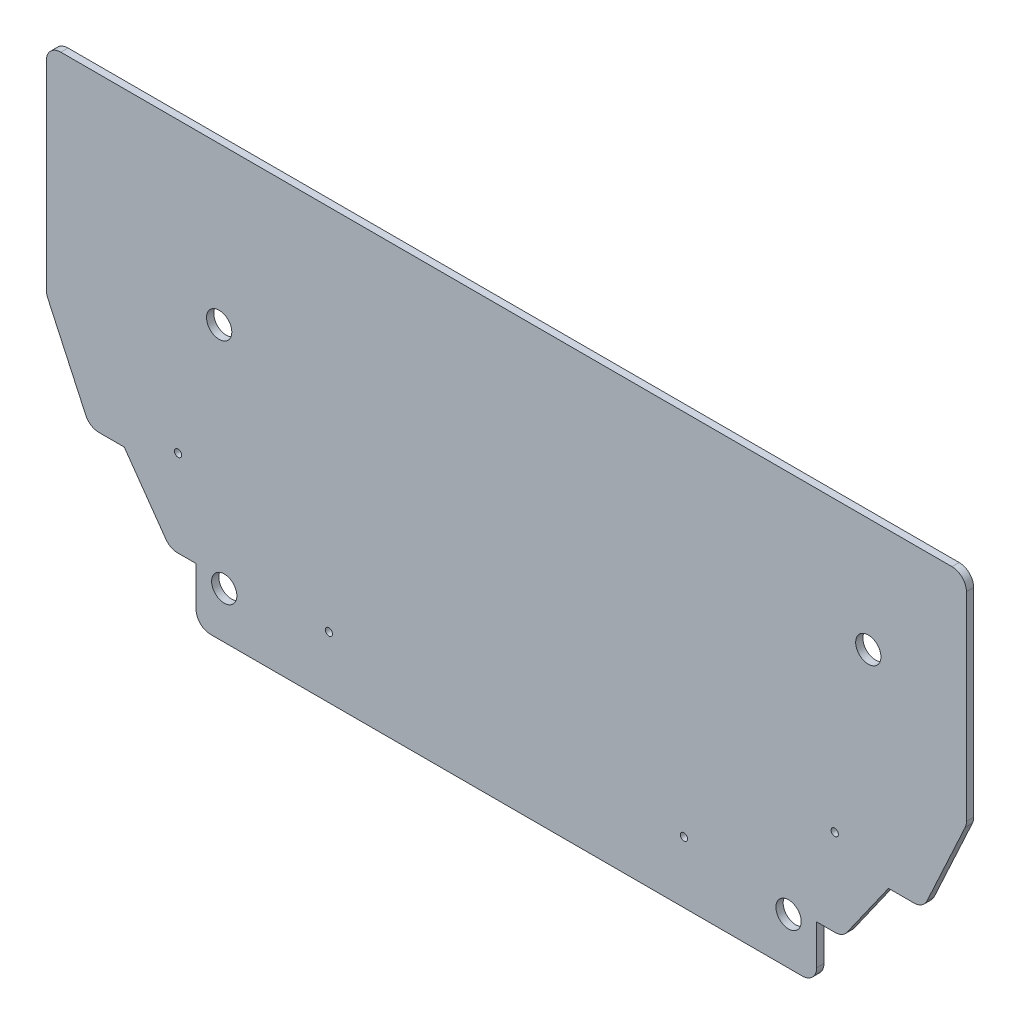
ISO-10303-21;
HEADER;
FILE_DESCRIPTION(('STEP AP214'),'2;1');
FILE_NAME('part.step','',(''),(''),'','','');
FILE_SCHEMA(('AUTOMOTIVE_DESIGN { 1 0 10303 214 1 1 1 1 }'));
ENDSEC;
DATA;
#1=APPLICATION_CONTEXT('core data for automotive mechanical design processes');
#2=APPLICATION_PROTOCOL_DEFINITION('international standard','automotive_design',2000,#1);
#3=PRODUCT_CONTEXT('',#1,'mechanical');
#4=PRODUCT('Part','Part','',(#3));
#5=PRODUCT_RELATED_PRODUCT_CATEGORY('part','',(#4));
#6=PRODUCT_DEFINITION_FORMATION('','',#4);
#7=PRODUCT_DEFINITION_CONTEXT('part definition',#1,'design');
#8=PRODUCT_DEFINITION('design','',#6,#7);
#9=PRODUCT_DEFINITION_SHAPE('','',#8);
#10=(LENGTH_UNIT() NAMED_UNIT(*) SI_UNIT(.MILLI.,.METRE.));
#11=(NAMED_UNIT(*) PLANE_ANGLE_UNIT() SI_UNIT($,.RADIAN.));
#12=(NAMED_UNIT(*) SI_UNIT($,.STERADIAN.) SOLID_ANGLE_UNIT());
#13=UNCERTAINTY_MEASURE_WITH_UNIT(LENGTH_MEASURE(1.E-05),#10,'distance_accuracy_value','');
#14=(GEOMETRIC_REPRESENTATION_CONTEXT(3) GLOBAL_UNCERTAINTY_ASSIGNED_CONTEXT((#13)) GLOBAL_UNIT_ASSIGNED_CONTEXT((#10,
#11,#12)) REPRESENTATION_CONTEXT('',''));
#15=CARTESIAN_POINT('',(0.,0.,0.));
#16=DIRECTION('',(0.,0.,1.));
#17=DIRECTION('',(1.,0.,0.));
#18=AXIS2_PLACEMENT_3D('',#15,#16,#17);
#19=CARTESIAN_POINT('',(0.,0.,1.));
#20=DIRECTION('',(1.,0.,0.));
#21=DIRECTION('',(0.,0.,-1.));
#22=AXIS2_PLACEMENT_3D('',#19,#20,#21);
#23=PLANE('',#22);
#24=DIRECTION('',(0.,-1.,0.));
#25=VECTOR('',#24,1.);
#26=CARTESIAN_POINT('',(0.,0.,0.));
#27=LINE('',#26,#25);
#28=CARTESIAN_POINT('',(0.,57.5,0.));
#29=VERTEX_POINT('',#28);
#30=CARTESIAN_POINT('',(0.,29.9392736877588,0.));
#31=VERTEX_POINT('',#30);
#32=EDGE_CURVE('E264',#29,#31,#27,.T.);
#33=ORIENTED_EDGE('',*,*,#32,.T.);
#34=DIRECTION('',(0.,0.,1.));
#35=VECTOR('',#34,1.);
#36=CARTESIAN_POINT('',(0.,29.9392736877588,1.));
#37=LINE('',#36,#35);
#38=CARTESIAN_POINT('',(0.,29.9392736877588,1.));
#39=VERTEX_POINT('',#38);
#40=EDGE_CURVE('E359',#31,#39,#37,.T.);
#41=ORIENTED_EDGE('',*,*,#40,.T.);
#42=DIRECTION('',(0.,-1.,0.));
#43=VECTOR('',#42,1.);
#44=CARTESIAN_POINT('',(0.,0.,1.));
#45=LINE('',#44,#43);
#46=CARTESIAN_POINT('',(0.,57.5,1.));
#47=VERTEX_POINT('',#46);
#48=EDGE_CURVE('E267',#47,#39,#45,.T.);
#49=ORIENTED_EDGE('',*,*,#48,.F.);
#50=DIRECTION('',(0.,0.,-1.));
#51=VECTOR('',#50,1.);
#52=CARTESIAN_POINT('',(0.,57.5,1.));
#53=LINE('',#52,#51);
#54=EDGE_CURVE('E356',#47,#29,#53,.T.);
#55=ORIENTED_EDGE('',*,*,#54,.T.);
#56=EDGE_LOOP('',(#33,#41,#49,#55));
#57=FACE_BOUND('',#56,.T.);
#58=ADVANCED_FACE('F33',(#57),#23,.F.);
#59=CARTESIAN_POINT('',(0.,0.,1.));
#60=DIRECTION('',(0.,1.,0.));
#61=DIRECTION('',(0.,0.,1.));
#62=AXIS2_PLACEMENT_3D('',#59,#60,#61);
#63=PLANE('',#62);
#64=DIRECTION('',(1.,0.,0.));
#65=VECTOR('',#64,1.);
#66=CARTESIAN_POINT('',(0.,0.,0.));
#67=LINE('',#66,#65);
#68=CARTESIAN_POINT('',(22.75,0.,0.));
#69=VERTEX_POINT('',#68);
#70=CARTESIAN_POINT('',(104.75,0.,0.));
#71=VERTEX_POINT('',#70);
#72=EDGE_CURVE('E283',#69,#71,#67,.T.);
#73=ORIENTED_EDGE('',*,*,#72,.T.);
#74=DIRECTION('',(0.,0.,1.));
#75=VECTOR('',#74,1.);
#76=CARTESIAN_POINT('',(104.75,0.,1.));
#77=LINE('',#76,#75);
#78=CARTESIAN_POINT('',(104.75,0.,1.));
#79=VERTEX_POINT('',#78);
#80=EDGE_CURVE('E369',#71,#79,#77,.T.);
#81=ORIENTED_EDGE('',*,*,#80,.T.);
#82=DIRECTION('',(1.,0.,0.));
#83=VECTOR('',#82,1.);
#84=CARTESIAN_POINT('',(0.,0.,1.));
#85=LINE('',#84,#83);
#86=CARTESIAN_POINT('',(22.75,0.,1.));
#87=VERTEX_POINT('',#86);
#88=EDGE_CURVE('E270',#87,#79,#85,.T.);
#89=ORIENTED_EDGE('',*,*,#88,.F.);
#90=DIRECTION('',(0.,0.,1.));
#91=VECTOR('',#90,1.);
#92=CARTESIAN_POINT('',(22.75,0.,1.));
#93=LINE('',#92,#91);
#94=EDGE_CURVE('E367',#87,#69,#93,.F.);
#95=ORIENTED_EDGE('',*,*,#94,.T.);
#96=EDGE_LOOP('',(#73,#81,#89,#95));
#97=FACE_BOUND('',#96,.T.);
#98=ADVANCED_FACE('F385',(#97),#63,.F.);
#99=CARTESIAN_POINT('',(127.5,0.,1.));
#100=DIRECTION('',(-1.,0.,0.));
#101=DIRECTION('',(0.,0.,1.));
#102=AXIS2_PLACEMENT_3D('',#99,#100,#101);
#103=PLANE('',#102);
#104=DIRECTION('',(0.,1.,0.));
#105=VECTOR('',#104,1.);
#106=CARTESIAN_POINT('',(127.5,0.,1.));
#107=LINE('',#106,#105);
#108=CARTESIAN_POINT('',(127.5,29.9392736877588,1.));
#109=VERTEX_POINT('',#108);
#110=CARTESIAN_POINT('',(127.5,57.5,1.));
#111=VERTEX_POINT('',#110);
#112=EDGE_CURVE('E274',#109,#111,#107,.T.);
#113=ORIENTED_EDGE('',*,*,#112,.F.);
#114=DIRECTION('',(0.,0.,1.));
#115=VECTOR('',#114,1.);
#116=CARTESIAN_POINT('',(127.5,29.9392736877588,1.));
#117=LINE('',#116,#115);
#118=CARTESIAN_POINT('',(127.5,29.9392736877588,0.));
#119=VERTEX_POINT('',#118);
#120=EDGE_CURVE('E344',#109,#119,#117,.F.);
#121=ORIENTED_EDGE('',*,*,#120,.T.);
#122=DIRECTION('',(0.,1.,0.));
#123=VECTOR('',#122,1.);
#124=CARTESIAN_POINT('',(127.5,0.,0.));
#125=LINE('',#124,#123);
#126=CARTESIAN_POINT('',(127.5,57.5,0.));
#127=VERTEX_POINT('',#126);
#128=EDGE_CURVE('E286',#119,#127,#125,.T.);
#129=ORIENTED_EDGE('',*,*,#128,.T.);
#130=DIRECTION('',(0.,0.,-1.));
#131=VECTOR('',#130,1.);
#132=CARTESIAN_POINT('',(127.5,57.5,1.));
#133=LINE('',#132,#131);
#134=EDGE_CURVE('E342',#127,#111,#133,.F.);
#135=ORIENTED_EDGE('',*,*,#134,.T.);
#136=EDGE_LOOP('',(#113,#121,#129,#135));
#137=FACE_BOUND('',#136,.T.);
#138=ADVANCED_FACE('F500',(#137),#103,.F.);
#139=CARTESIAN_POINT('',(0.,59.5,1.));
#140=DIRECTION('',(0.,-1.,0.));
#141=DIRECTION('',(0.,0.,-1.));
#142=AXIS2_PLACEMENT_3D('',#139,#140,#141);
#143=PLANE('',#142);
#144=DIRECTION('',(-1.,0.,0.));
#145=VECTOR('',#144,1.);
#146=CARTESIAN_POINT('',(0.,59.5,1.));
#147=LINE('',#146,#145);
#148=CARTESIAN_POINT('',(125.5,59.5,1.));
#149=VERTEX_POINT('',#148);
#150=CARTESIAN_POINT('',(2.,59.5,1.));
#151=VERTEX_POINT('',#150);
#152=EDGE_CURVE('E277',#149,#151,#147,.T.);
#153=ORIENTED_EDGE('',*,*,#152,.F.);
#154=DIRECTION('',(0.,0.,-1.));
#155=VECTOR('',#154,1.);
#156=CARTESIAN_POINT('',(125.5,59.5,1.));
#157=LINE('',#156,#155);
#158=CARTESIAN_POINT('',(125.5,59.5,0.));
#159=VERTEX_POINT('',#158);
#160=EDGE_CURVE('E364',#149,#159,#157,.T.);
#161=ORIENTED_EDGE('',*,*,#160,.T.);
#162=DIRECTION('',(-1.,0.,0.));
#163=VECTOR('',#162,1.);
#164=CARTESIAN_POINT('',(0.,59.5,0.));
#165=LINE('',#164,#163);
#166=CARTESIAN_POINT('',(2.,59.5,0.));
#167=VERTEX_POINT('',#166);
#168=EDGE_CURVE('E271',#159,#167,#165,.T.);
#169=ORIENTED_EDGE('',*,*,#168,.T.);
#170=DIRECTION('',(0.,0.,-1.));
#171=VECTOR('',#170,1.);
#172=CARTESIAN_POINT('',(2.,59.5,1.));
#173=LINE('',#172,#171);
#174=EDGE_CURVE('E362',#167,#151,#173,.F.);
#175=ORIENTED_EDGE('',*,*,#174,.T.);
#176=EDGE_LOOP('',(#153,#161,#169,#175));
#177=FACE_BOUND('',#176,.T.);
#178=ADVANCED_FACE('F462',(#177),#143,.F.);
#179=CARTESIAN_POINT('',(0.,0.,1.));
#180=DIRECTION('',(0.,0.,-1.));
#181=DIRECTION('',(-1.,0.,0.));
#182=AXIS2_PLACEMENT_3D('',#179,#180,#181);
#183=PLANE('',#182);
#184=CARTESIAN_POINT('',(18.25,19.5,1.));
#185=DIRECTION('',(0.,0.,1.));
#186=DIRECTION('',(1.,0.,0.));
#187=AXIS2_PLACEMENT_3D('',#184,#185,#186);
#188=CIRCLE('',#187,0.499999999999999);
#189=CARTESIAN_POINT('',(18.75,19.5,1.));
#190=VERTEX_POINT('',#189);
#191=EDGE_CURVE('E444',#190,#190,#188,.T.);
#192=ORIENTED_EDGE('',*,*,#191,.F.);
#193=EDGE_LOOP('',(#192));
#194=FACE_BOUND('',#193,.T.);
#195=CARTESIAN_POINT('',(109.25,19.5,1.));
#196=DIRECTION('',(0.,0.,1.));
#197=DIRECTION('',(1.,0.,0.));
#198=AXIS2_PLACEMENT_3D('',#195,#196,#197);
#199=CIRCLE('',#198,0.499999999999999);
#200=CARTESIAN_POINT('',(109.75,19.5,1.));
#201=VERTEX_POINT('',#200);
#202=EDGE_CURVE('E438',#201,#201,#199,.T.);
#203=ORIENTED_EDGE('',*,*,#202,.F.);
#204=EDGE_LOOP('',(#203));
#205=FACE_BOUND('',#204,.T.);
#206=CARTESIAN_POINT('',(88.35,8.50000000000001,1.));
#207=DIRECTION('',(0.,0.,1.));
#208=DIRECTION('',(1.,0.,0.));
#209=AXIS2_PLACEMENT_3D('',#206,#207,#208);
#210=CIRCLE('',#209,0.499999999999999);
#211=CARTESIAN_POINT('',(88.85,8.50000000000001,1.));
#212=VERTEX_POINT('',#211);
#213=EDGE_CURVE('E432',#212,#212,#210,.T.);
#214=ORIENTED_EDGE('',*,*,#213,.F.);
#215=EDGE_LOOP('',(#214));
#216=FACE_BOUND('',#215,.T.);
#217=CARTESIAN_POINT('',(39.15,8.5,1.));
#218=DIRECTION('',(0.,0.,1.));
#219=DIRECTION('',(1.,0.,0.));
#220=AXIS2_PLACEMENT_3D('',#217,#218,#219);
#221=CIRCLE('',#220,0.499999999999999);
#222=CARTESIAN_POINT('',(39.65,8.5,1.));
#223=VERTEX_POINT('',#222);
#224=EDGE_CURVE('E426',#223,#223,#221,.T.);
#225=ORIENTED_EDGE('',*,*,#224,.F.);
#226=EDGE_LOOP('',(#225));
#227=FACE_BOUND('',#226,.T.);
#228=CARTESIAN_POINT('',(24.65,6.45000000000001,1.));
#229=DIRECTION('',(0.,0.,1.));
#230=DIRECTION('',(1.,0.,0.));
#231=AXIS2_PLACEMENT_3D('',#228,#229,#230);
#232=CIRCLE('',#231,1.75);
#233=CARTESIAN_POINT('',(26.4,6.45000000000001,1.));
#234=VERTEX_POINT('',#233);
#235=EDGE_CURVE('E420',#234,#234,#232,.T.);
#236=ORIENTED_EDGE('',*,*,#235,.F.);
#237=EDGE_LOOP('',(#236));
#238=FACE_BOUND('',#237,.T.);
#239=CARTESIAN_POINT('',(23.95,37.75,1.));
#240=DIRECTION('',(0.,0.,1.));
#241=DIRECTION('',(1.,0.,0.));
#242=AXIS2_PLACEMENT_3D('',#239,#240,#241);
#243=CIRCLE('',#242,1.75);
#244=CARTESIAN_POINT('',(25.7,37.75,1.));
#245=VERTEX_POINT('',#244);
#246=EDGE_CURVE('E414',#245,#245,#243,.T.);
#247=ORIENTED_EDGE('',*,*,#246,.F.);
#248=EDGE_LOOP('',(#247));
#249=FACE_BOUND('',#248,.T.);
#250=CARTESIAN_POINT('',(113.9,43.75,1.));
#251=DIRECTION('',(0.,0.,1.));
#252=DIRECTION('',(1.,0.,0.));
#253=AXIS2_PLACEMENT_3D('',#250,#251,#252);
#254=CIRCLE('',#253,1.75);
#255=CARTESIAN_POINT('',(115.65,43.75,1.));
#256=VERTEX_POINT('',#255);
#257=EDGE_CURVE('E408',#256,#256,#254,.T.);
#258=ORIENTED_EDGE('',*,*,#257,.F.);
#259=EDGE_LOOP('',(#258));
#260=FACE_BOUND('',#259,.T.);
#261=CARTESIAN_POINT('',(102.85,6.45000000000001,1.));
#262=DIRECTION('',(0.,0.,1.));
#263=DIRECTION('',(1.,0.,0.));
#264=AXIS2_PLACEMENT_3D('',#261,#262,#263);
#265=CIRCLE('',#264,1.75);
#266=CARTESIAN_POINT('',(104.6,6.45000000000001,1.));
#267=VERTEX_POINT('',#266);
#268=EDGE_CURVE('E402',#267,#267,#265,.T.);
#269=ORIENTED_EDGE('',*,*,#268,.F.);
#270=EDGE_LOOP('',(#269));
#271=FACE_BOUND('',#270,.T.);
#272=DIRECTION('',(-1.,0.,0.));
#273=VECTOR('',#272,1.);
#274=CARTESIAN_POINT('',(110.35,7.5,1.));
#275=LINE('',#274,#273);
#276=CARTESIAN_POINT('',(109.313411258617,7.5,1.));
#277=VERTEX_POINT('',#276);
#278=CARTESIAN_POINT('',(106.75,7.5,1.));
#279=VERTEX_POINT('',#278);
#280=EDGE_CURVE('E257',#277,#279,#275,.T.);
#281=ORIENTED_EDGE('',*,*,#280,.F.);
#282=CARTESIAN_POINT('',(109.313411258617,9.5,1.));
#283=DIRECTION('',(0.,0.,-1.));
#284=DIRECTION('',(-1.,0.,0.));
#285=AXIS2_PLACEMENT_3D('',#282,#283,#284);
#286=CIRCLE('',#285,2.);
#287=CARTESIAN_POINT('',(110.947598553241,8.34699007545957,1.));
#288=VERTEX_POINT('',#287);
#289=EDGE_CURVE('E311',#277,#288,#286,.F.);
#290=ORIENTED_EDGE('',*,*,#289,.T.);
#291=DIRECTION('',(-0.576504962270215,-0.817093647312117,0.));
#292=VECTOR('',#291,1.);
#293=CARTESIAN_POINT('',(116.7,16.5,1.));
#294=LINE('',#293,#292);
#295=CARTESIAN_POINT('',(116.7,16.5,1.));
#296=VERTEX_POINT('',#295);
#297=EDGE_CURVE('E254',#296,#288,#294,.T.);
#298=ORIENTED_EDGE('',*,*,#297,.F.);
#299=DIRECTION('',(-1.,0.,0.));
#300=VECTOR('',#299,1.);
#301=CARTESIAN_POINT('',(121.5,16.5,1.));
#302=LINE('',#301,#300);
#303=CARTESIAN_POINT('',(120.220335221034,16.5,1.));
#304=VERTEX_POINT('',#303);
#305=EDGE_CURVE('E252',#304,#296,#302,.T.);
#306=ORIENTED_EDGE('',*,*,#305,.F.);
#307=CARTESIAN_POINT('',(120.220335221034,18.5,1.));
#308=DIRECTION('',(0.,0.,-1.));
#309=DIRECTION('',(-1.,0.,0.));
#310=AXIS2_PLACEMENT_3D('',#307,#308,#309);
#311=CIRCLE('',#310,2.);
#312=CARTESIAN_POINT('',(122.036253990035,17.6618836450765,1.));
#313=VERTEX_POINT('',#312);
#314=EDGE_CURVE('E309',#304,#313,#311,.F.);
#315=ORIENTED_EDGE('',*,*,#314,.T.);
#316=DIRECTION('',(-0.419058177461747,-0.907959384500451,0.));
#317=VECTOR('',#316,1.);
#318=CARTESIAN_POINT('',(127.5,29.5,1.));
#319=LINE('',#318,#317);
#320=CARTESIAN_POINT('',(127.315918769001,29.1011573328353,1.));
#321=VERTEX_POINT('',#320);
#322=EDGE_CURVE('E211',#321,#313,#319,.T.);
#323=ORIENTED_EDGE('',*,*,#322,.F.);
#324=CARTESIAN_POINT('',(125.5,29.9392736877588,1.));
#325=DIRECTION('',(0.,0.,-1.));
#326=DIRECTION('',(-1.,0.,0.));
#327=AXIS2_PLACEMENT_3D('',#324,#325,#326);
#328=CIRCLE('',#327,2.);
#329=EDGE_CURVE('E307',#321,#109,#328,.F.);
#330=ORIENTED_EDGE('',*,*,#329,.T.);
#331=ORIENTED_EDGE('',*,*,#112,.T.);
#332=CARTESIAN_POINT('',(125.5,57.5,1.));
#333=DIRECTION('',(0.,0.,-1.));
#334=DIRECTION('',(-1.,0.,0.));
#335=AXIS2_PLACEMENT_3D('',#332,#333,#334);
#336=CIRCLE('',#335,2.);
#337=EDGE_CURVE('E299',#111,#149,#336,.F.);
#338=ORIENTED_EDGE('',*,*,#337,.T.);
#339=ORIENTED_EDGE('',*,*,#152,.T.);
#340=CARTESIAN_POINT('',(2.,57.5,1.));
#341=DIRECTION('',(0.,0.,-1.));
#342=DIRECTION('',(-1.,0.,0.));
#343=AXIS2_PLACEMENT_3D('',#340,#341,#342);
#344=CIRCLE('',#343,2.);
#345=EDGE_CURVE('E297',#151,#47,#344,.F.);
#346=ORIENTED_EDGE('',*,*,#345,.T.);
#347=ORIENTED_EDGE('',*,*,#48,.T.);
#348=CARTESIAN_POINT('',(2.,29.9392736877588,1.));
#349=DIRECTION('',(0.,0.,-1.));
#350=DIRECTION('',(-1.,0.,0.));
#351=AXIS2_PLACEMENT_3D('',#348,#349,#350);
#352=CIRCLE('',#351,2.);
#353=CARTESIAN_POINT('',(0.184081230999098,29.1011573328353,1.));
#354=VERTEX_POINT('',#353);
#355=EDGE_CURVE('E301',#39,#354,#352,.F.);
#356=ORIENTED_EDGE('',*,*,#355,.T.);
#357=DIRECTION('',(-0.419058177461747,0.907959384500451,0.));
#358=VECTOR('',#357,1.);
#359=CARTESIAN_POINT('',(0.,29.5,1.));
#360=LINE('',#359,#358);
#361=CARTESIAN_POINT('',(5.46374600996469,17.6618836450765,1.));
#362=VERTEX_POINT('',#361);
#363=EDGE_CURVE('E230',#362,#354,#360,.T.);
#364=ORIENTED_EDGE('',*,*,#363,.F.);
#365=CARTESIAN_POINT('',(7.2796647789656,18.5,1.));
#366=DIRECTION('',(0.,0.,-1.));
#367=DIRECTION('',(-1.,0.,0.));
#368=AXIS2_PLACEMENT_3D('',#365,#366,#367);
#369=CIRCLE('',#368,2.);
#370=CARTESIAN_POINT('',(7.2796647789656,16.5,1.));
#371=VERTEX_POINT('',#370);
#372=EDGE_CURVE('E303',#362,#371,#369,.F.);
#373=ORIENTED_EDGE('',*,*,#372,.T.);
#374=DIRECTION('',(-1.,0.,0.));
#375=VECTOR('',#374,1.);
#376=CARTESIAN_POINT('',(6.00000000000001,16.5,1.));
#377=LINE('',#376,#375);
#378=CARTESIAN_POINT('',(10.8,16.5,1.));
#379=VERTEX_POINT('',#378);
#380=EDGE_CURVE('E228',#379,#371,#377,.T.);
#381=ORIENTED_EDGE('',*,*,#380,.F.);
#382=DIRECTION('',(-0.576504962270215,0.817093647312117,0.));
#383=VECTOR('',#382,1.);
#384=CARTESIAN_POINT('',(10.8,16.5,1.));
#385=LINE('',#384,#383);
#386=CARTESIAN_POINT('',(16.5524014467591,8.34699007545957,1.));
#387=VERTEX_POINT('',#386);
#388=EDGE_CURVE('E209',#387,#379,#385,.T.);
#389=ORIENTED_EDGE('',*,*,#388,.F.);
#390=CARTESIAN_POINT('',(18.1865887413833,9.5,1.));
#391=DIRECTION('',(0.,0.,-1.));
#392=DIRECTION('',(-1.,0.,0.));
#393=AXIS2_PLACEMENT_3D('',#390,#391,#392);
#394=CIRCLE('',#393,2.);
#395=CARTESIAN_POINT('',(18.1865887413833,7.5,1.));
#396=VERTEX_POINT('',#395);
#397=EDGE_CURVE('E305',#387,#396,#394,.F.);
#398=ORIENTED_EDGE('',*,*,#397,.T.);
#399=DIRECTION('',(-1.,0.,0.));
#400=VECTOR('',#399,1.);
#401=CARTESIAN_POINT('',(17.15,7.5,1.));
#402=LINE('',#401,#400);
#403=CARTESIAN_POINT('',(20.75,7.5,1.));
#404=VERTEX_POINT('',#403);
#405=EDGE_CURVE('E223',#404,#396,#402,.T.);
#406=ORIENTED_EDGE('',*,*,#405,.F.);
#407=DIRECTION('',(0.,1.,0.));
#408=VECTOR('',#407,1.);
#409=CARTESIAN_POINT('',(20.75,7.5,1.));
#410=LINE('',#409,#408);
#411=CARTESIAN_POINT('',(20.75,2.,1.));
#412=VERTEX_POINT('',#411);
#413=EDGE_CURVE('E221',#412,#404,#410,.T.);
#414=ORIENTED_EDGE('',*,*,#413,.F.);
#415=CARTESIAN_POINT('',(22.75,2.,1.));
#416=DIRECTION('',(0.,0.,-1.));
#417=DIRECTION('',(-1.,0.,0.));
#418=AXIS2_PLACEMENT_3D('',#415,#416,#417);
#419=CIRCLE('',#418,2.);
#420=EDGE_CURVE('E293',#412,#87,#419,.F.);
#421=ORIENTED_EDGE('',*,*,#420,.T.);
#422=ORIENTED_EDGE('',*,*,#88,.T.);
#423=CARTESIAN_POINT('',(104.75,2.,1.));
#424=DIRECTION('',(0.,0.,-1.));
#425=DIRECTION('',(-1.,0.,0.));
#426=AXIS2_PLACEMENT_3D('',#423,#424,#425);
#427=CIRCLE('',#426,2.);
#428=CARTESIAN_POINT('',(106.75,2.,1.));
#429=VERTEX_POINT('',#428);
#430=EDGE_CURVE('E295',#79,#429,#427,.F.);
#431=ORIENTED_EDGE('',*,*,#430,.T.);
#432=DIRECTION('',(0.,-1.,0.));
#433=VECTOR('',#432,1.);
#434=CARTESIAN_POINT('',(106.75,7.5,1.));
#435=LINE('',#434,#433);
#436=EDGE_CURVE('E240',#279,#429,#435,.T.);
#437=ORIENTED_EDGE('',*,*,#436,.F.);
#438=EDGE_LOOP('',(#281,#290,#298,#306,#315,#323,#330,#331,#338,#339,#346,#347,#356,#364,#373,
#381,#389,#398,#406,#414,#421,#422,#431,#437));
#439=FACE_BOUND('',#438,.T.);
#440=ADVANCED_FACE('F389',(#194,#205,#216,#227,#238,#249,#260,#271,#439),#183,.F.);
#441=CARTESIAN_POINT('',(0.,0.,0.));
#442=DIRECTION('',(0.,0.,-1.));
#443=DIRECTION('',(-1.,0.,0.));
#444=AXIS2_PLACEMENT_3D('',#441,#442,#443);
#445=PLANE('',#444);
#446=CARTESIAN_POINT('',(18.25,19.5,0.));
#447=DIRECTION('',(0.,0.,1.));
#448=DIRECTION('',(1.,0.,0.));
#449=AXIS2_PLACEMENT_3D('',#446,#447,#448);
#450=CIRCLE('',#449,0.499999999999999);
#451=CARTESIAN_POINT('',(18.75,19.5,0.));
#452=VERTEX_POINT('',#451);
#453=EDGE_CURVE('E441',#452,#452,#450,.T.);
#454=ORIENTED_EDGE('',*,*,#453,.T.);
#455=EDGE_LOOP('',(#454));
#456=FACE_BOUND('',#455,.T.);
#457=CARTESIAN_POINT('',(109.25,19.5,0.));
#458=DIRECTION('',(0.,0.,1.));
#459=DIRECTION('',(1.,0.,0.));
#460=AXIS2_PLACEMENT_3D('',#457,#458,#459);
#461=CIRCLE('',#460,0.499999999999999);
#462=CARTESIAN_POINT('',(109.75,19.5,0.));
#463=VERTEX_POINT('',#462);
#464=EDGE_CURVE('E435',#463,#463,#461,.T.);
#465=ORIENTED_EDGE('',*,*,#464,.T.);
#466=EDGE_LOOP('',(#465));
#467=FACE_BOUND('',#466,.T.);
#468=CARTESIAN_POINT('',(88.35,8.50000000000001,0.));
#469=DIRECTION('',(0.,0.,1.));
#470=DIRECTION('',(1.,0.,0.));
#471=AXIS2_PLACEMENT_3D('',#468,#469,#470);
#472=CIRCLE('',#471,0.499999999999999);
#473=CARTESIAN_POINT('',(88.85,8.50000000000001,0.));
#474=VERTEX_POINT('',#473);
#475=EDGE_CURVE('E429',#474,#474,#472,.T.);
#476=ORIENTED_EDGE('',*,*,#475,.T.);
#477=EDGE_LOOP('',(#476));
#478=FACE_BOUND('',#477,.T.);
#479=CARTESIAN_POINT('',(39.15,8.5,0.));
#480=DIRECTION('',(0.,0.,1.));
#481=DIRECTION('',(1.,0.,0.));
#482=AXIS2_PLACEMENT_3D('',#479,#480,#481);
#483=CIRCLE('',#482,0.499999999999999);
#484=CARTESIAN_POINT('',(39.65,8.5,0.));
#485=VERTEX_POINT('',#484);
#486=EDGE_CURVE('E423',#485,#485,#483,.T.);
#487=ORIENTED_EDGE('',*,*,#486,.T.);
#488=EDGE_LOOP('',(#487));
#489=FACE_BOUND('',#488,.T.);
#490=CARTESIAN_POINT('',(24.65,6.45000000000001,0.));
#491=DIRECTION('',(0.,0.,1.));
#492=DIRECTION('',(1.,0.,0.));
#493=AXIS2_PLACEMENT_3D('',#490,#491,#492);
#494=CIRCLE('',#493,1.75);
#495=CARTESIAN_POINT('',(26.4,6.45000000000001,0.));
#496=VERTEX_POINT('',#495);
#497=EDGE_CURVE('E417',#496,#496,#494,.T.);
#498=ORIENTED_EDGE('',*,*,#497,.T.);
#499=EDGE_LOOP('',(#498));
#500=FACE_BOUND('',#499,.T.);
#501=CARTESIAN_POINT('',(23.95,37.75,0.));
#502=DIRECTION('',(0.,0.,1.));
#503=DIRECTION('',(1.,0.,0.));
#504=AXIS2_PLACEMENT_3D('',#501,#502,#503);
#505=CIRCLE('',#504,1.75);
#506=CARTESIAN_POINT('',(25.7,37.75,0.));
#507=VERTEX_POINT('',#506);
#508=EDGE_CURVE('E411',#507,#507,#505,.T.);
#509=ORIENTED_EDGE('',*,*,#508,.T.);
#510=EDGE_LOOP('',(#509));
#511=FACE_BOUND('',#510,.T.);
#512=CARTESIAN_POINT('',(113.9,43.75,0.));
#513=DIRECTION('',(0.,0.,1.));
#514=DIRECTION('',(1.,0.,0.));
#515=AXIS2_PLACEMENT_3D('',#512,#513,#514);
#516=CIRCLE('',#515,1.75);
#517=CARTESIAN_POINT('',(115.65,43.75,0.));
#518=VERTEX_POINT('',#517);
#519=EDGE_CURVE('E405',#518,#518,#516,.T.);
#520=ORIENTED_EDGE('',*,*,#519,.T.);
#521=EDGE_LOOP('',(#520));
#522=FACE_BOUND('',#521,.T.);
#523=CARTESIAN_POINT('',(102.85,6.45000000000001,0.));
#524=DIRECTION('',(0.,0.,1.));
#525=DIRECTION('',(1.,0.,0.));
#526=AXIS2_PLACEMENT_3D('',#523,#524,#525);
#527=CIRCLE('',#526,1.75);
#528=CARTESIAN_POINT('',(104.6,6.45000000000001,0.));
#529=VERTEX_POINT('',#528);
#530=EDGE_CURVE('E224',#529,#529,#527,.T.);
#531=ORIENTED_EDGE('',*,*,#530,.T.);
#532=EDGE_LOOP('',(#531));
#533=FACE_BOUND('',#532,.T.);
#534=DIRECTION('',(-0.576504962270215,-0.817093647312117,0.));
#535=VECTOR('',#534,1.);
#536=CARTESIAN_POINT('',(116.7,16.5,0.));
#537=LINE('',#536,#535);
#538=CARTESIAN_POINT('',(116.7,16.5,0.));
#539=VERTEX_POINT('',#538);
#540=CARTESIAN_POINT('',(110.947598553241,8.34699007545957,0.));
#541=VERTEX_POINT('',#540);
#542=EDGE_CURVE('E242',#539,#541,#537,.T.);
#543=ORIENTED_EDGE('',*,*,#542,.T.);
#544=CARTESIAN_POINT('',(109.313411258617,9.5,0.));
#545=DIRECTION('',(0.,0.,-1.));
#546=DIRECTION('',(-1.,0.,0.));
#547=AXIS2_PLACEMENT_3D('',#544,#545,#546);
#548=CIRCLE('',#547,2.);
#549=CARTESIAN_POINT('',(109.313411258617,7.5,0.));
#550=VERTEX_POINT('',#549);
#551=EDGE_CURVE('E332',#541,#550,#548,.T.);
#552=ORIENTED_EDGE('',*,*,#551,.T.);
#553=DIRECTION('',(-1.,0.,0.));
#554=VECTOR('',#553,1.);
#555=CARTESIAN_POINT('',(110.35,7.5,0.));
#556=LINE('',#555,#554);
#557=CARTESIAN_POINT('',(106.75,7.5,0.));
#558=VERTEX_POINT('',#557);
#559=EDGE_CURVE('E244',#550,#558,#556,.T.);
#560=ORIENTED_EDGE('',*,*,#559,.T.);
#561=DIRECTION('',(0.,-1.,0.));
#562=VECTOR('',#561,1.);
#563=CARTESIAN_POINT('',(106.75,7.5,0.));
#564=LINE('',#563,#562);
#565=CARTESIAN_POINT('',(106.75,2.,0.));
#566=VERTEX_POINT('',#565);
#567=EDGE_CURVE('E246',#558,#566,#564,.T.);
#568=ORIENTED_EDGE('',*,*,#567,.T.);
#569=CARTESIAN_POINT('',(104.75,2.,0.));
#570=DIRECTION('',(0.,0.,-1.));
#571=DIRECTION('',(-1.,0.,0.));
#572=AXIS2_PLACEMENT_3D('',#569,#570,#571);
#573=CIRCLE('',#572,2.);
#574=EDGE_CURVE('E317',#566,#71,#573,.T.);
#575=ORIENTED_EDGE('',*,*,#574,.T.);
#576=ORIENTED_EDGE('',*,*,#72,.F.);
#577=CARTESIAN_POINT('',(22.75,2.,0.));
#578=DIRECTION('',(0.,0.,-1.));
#579=DIRECTION('',(-1.,0.,0.));
#580=AXIS2_PLACEMENT_3D('',#577,#578,#579);
#581=CIRCLE('',#580,2.);
#582=CARTESIAN_POINT('',(20.75,2.,0.));
#583=VERTEX_POINT('',#582);
#584=EDGE_CURVE('E315',#69,#583,#581,.T.);
#585=ORIENTED_EDGE('',*,*,#584,.T.);
#586=DIRECTION('',(0.,1.,0.));
#587=VECTOR('',#586,1.);
#588=CARTESIAN_POINT('',(20.75,7.5,0.));
#589=LINE('',#588,#587);
#590=CARTESIAN_POINT('',(20.75,7.5,0.));
#591=VERTEX_POINT('',#590);
#592=EDGE_CURVE('E232',#583,#591,#589,.T.);
#593=ORIENTED_EDGE('',*,*,#592,.T.);
#594=DIRECTION('',(-1.,0.,0.));
#595=VECTOR('',#594,1.);
#596=CARTESIAN_POINT('',(17.15,7.5,0.));
#597=LINE('',#596,#595);
#598=CARTESIAN_POINT('',(18.1865887413833,7.5,0.));
#599=VERTEX_POINT('',#598);
#600=EDGE_CURVE('E203',#591,#599,#597,.T.);
#601=ORIENTED_EDGE('',*,*,#600,.T.);
#602=CARTESIAN_POINT('',(18.1865887413833,9.5,0.));
#603=DIRECTION('',(0.,0.,-1.));
#604=DIRECTION('',(-1.,0.,0.));
#605=AXIS2_PLACEMENT_3D('',#602,#603,#604);
#606=CIRCLE('',#605,2.);
#607=CARTESIAN_POINT('',(16.5524014467591,8.34699007545957,0.));
#608=VERTEX_POINT('',#607);
#609=EDGE_CURVE('E56',#599,#608,#606,.T.);
#610=ORIENTED_EDGE('',*,*,#609,.T.);
#611=DIRECTION('',(-0.576504962270215,0.817093647312117,0.));
#612=VECTOR('',#611,1.);
#613=CARTESIAN_POINT('',(10.8,16.5,0.));
#614=LINE('',#613,#612);
#615=CARTESIAN_POINT('',(10.8,16.5,0.));
#616=VERTEX_POINT('',#615);
#617=EDGE_CURVE('E194',#608,#616,#614,.T.);
#618=ORIENTED_EDGE('',*,*,#617,.T.);
#619=DIRECTION('',(-1.,0.,0.));
#620=VECTOR('',#619,1.);
#621=CARTESIAN_POINT('',(6.00000000000001,16.5,0.));
#622=LINE('',#621,#620);
#623=CARTESIAN_POINT('',(7.2796647789656,16.5,0.));
#624=VERTEX_POINT('',#623);
#625=EDGE_CURVE('E198',#616,#624,#622,.T.);
#626=ORIENTED_EDGE('',*,*,#625,.T.);
#627=CARTESIAN_POINT('',(7.2796647789656,18.5,0.));
#628=DIRECTION('',(0.,0.,-1.));
#629=DIRECTION('',(-1.,0.,0.));
#630=AXIS2_PLACEMENT_3D('',#627,#628,#629);
#631=CIRCLE('',#630,2.);
#632=CARTESIAN_POINT('',(5.46374600996469,17.6618836450765,0.));
#633=VERTEX_POINT('',#632);
#634=EDGE_CURVE('E325',#624,#633,#631,.T.);
#635=ORIENTED_EDGE('',*,*,#634,.T.);
#636=DIRECTION('',(-0.419058177461747,0.907959384500451,0.));
#637=VECTOR('',#636,1.);
#638=CARTESIAN_POINT('',(0.,29.5,0.));
#639=LINE('',#638,#637);
#640=CARTESIAN_POINT('',(0.184081230999098,29.1011573328353,0.));
#641=VERTEX_POINT('',#640);
#642=EDGE_CURVE('E215',#633,#641,#639,.T.);
#643=ORIENTED_EDGE('',*,*,#642,.T.);
#644=CARTESIAN_POINT('',(2.,29.9392736877588,0.));
#645=DIRECTION('',(0.,0.,-1.));
#646=DIRECTION('',(-1.,0.,0.));
#647=AXIS2_PLACEMENT_3D('',#644,#645,#646);
#648=CIRCLE('',#647,2.);
#649=EDGE_CURVE('E323',#641,#31,#648,.T.);
#650=ORIENTED_EDGE('',*,*,#649,.T.);
#651=ORIENTED_EDGE('',*,*,#32,.F.);
#652=CARTESIAN_POINT('',(2.,57.5,0.));
#653=DIRECTION('',(0.,0.,-1.));
#654=DIRECTION('',(-1.,0.,0.));
#655=AXIS2_PLACEMENT_3D('',#652,#653,#654);
#656=CIRCLE('',#655,2.);
#657=EDGE_CURVE('E319',#29,#167,#656,.T.);
#658=ORIENTED_EDGE('',*,*,#657,.T.);
#659=ORIENTED_EDGE('',*,*,#168,.F.);
#660=CARTESIAN_POINT('',(125.5,57.5,0.));
#661=DIRECTION('',(0.,0.,-1.));
#662=DIRECTION('',(-1.,0.,0.));
#663=AXIS2_PLACEMENT_3D('',#660,#661,#662);
#664=CIRCLE('',#663,2.);
#665=EDGE_CURVE('E321',#159,#127,#664,.T.);
#666=ORIENTED_EDGE('',*,*,#665,.T.);
#667=ORIENTED_EDGE('',*,*,#128,.F.);
#668=CARTESIAN_POINT('',(125.5,29.9392736877588,0.));
#669=DIRECTION('',(0.,0.,-1.));
#670=DIRECTION('',(-1.,0.,0.));
#671=AXIS2_PLACEMENT_3D('',#668,#669,#670);
#672=CIRCLE('',#671,2.);
#673=CARTESIAN_POINT('',(127.315918769001,29.1011573328353,0.));
#674=VERTEX_POINT('',#673);
#675=EDGE_CURVE('E328',#119,#674,#672,.T.);
#676=ORIENTED_EDGE('',*,*,#675,.T.);
#677=DIRECTION('',(-0.419058177461747,-0.907959384500451,0.));
#678=VECTOR('',#677,1.);
#679=CARTESIAN_POINT('',(127.5,29.5,0.));
#680=LINE('',#679,#678);
#681=CARTESIAN_POINT('',(122.036253990035,17.6618836450765,0.));
#682=VERTEX_POINT('',#681);
#683=EDGE_CURVE('E236',#674,#682,#680,.T.);
#684=ORIENTED_EDGE('',*,*,#683,.T.);
#685=CARTESIAN_POINT('',(120.220335221034,18.5,0.));
#686=DIRECTION('',(0.,0.,-1.));
#687=DIRECTION('',(-1.,0.,0.));
#688=AXIS2_PLACEMENT_3D('',#685,#686,#687);
#689=CIRCLE('',#688,2.);
#690=CARTESIAN_POINT('',(120.220335221034,16.5,0.));
#691=VERTEX_POINT('',#690);
#692=EDGE_CURVE('E330',#682,#691,#689,.T.);
#693=ORIENTED_EDGE('',*,*,#692,.T.);
#694=DIRECTION('',(-1.,0.,0.));
#695=VECTOR('',#694,1.);
#696=CARTESIAN_POINT('',(121.5,16.5,0.));
#697=LINE('',#696,#695);
#698=EDGE_CURVE('E239',#691,#539,#697,.T.);
#699=ORIENTED_EDGE('',*,*,#698,.T.);
#700=EDGE_LOOP('',(#543,#552,#560,#568,#575,#576,#585,#593,#601,#610,#618,#626,#635,#643,#650,
#651,#658,#659,#666,#667,#676,#684,#693,#699));
#701=FACE_BOUND('',#700,.T.);
#702=ADVANCED_FACE('F197',(#456,#467,#478,#489,#500,#511,#522,#533,#701),#445,.T.);
#703=CARTESIAN_POINT('',(106.75,7.5,0.));
#704=DIRECTION('',(-1.,0.,0.));
#705=DIRECTION('',(0.,0.,1.));
#706=AXIS2_PLACEMENT_3D('',#703,#704,#705);
#707=PLANE('',#706);
#708=ORIENTED_EDGE('',*,*,#436,.T.);
#709=DIRECTION('',(0.,0.,1.));
#710=VECTOR('',#709,1.);
#711=CARTESIAN_POINT('',(106.75,2.,0.));
#712=LINE('',#711,#710);
#713=EDGE_CURVE('E41',#429,#566,#712,.F.);
#714=ORIENTED_EDGE('',*,*,#713,.T.);
#715=ORIENTED_EDGE('',*,*,#567,.F.);
#716=DIRECTION('',(0.,0.,1.));
#717=VECTOR('',#716,1.);
#718=CARTESIAN_POINT('',(106.75,7.5,0.));
#719=LINE('',#718,#717);
#720=EDGE_CURVE('E261',#558,#279,#719,.T.);
#721=ORIENTED_EDGE('',*,*,#720,.T.);
#722=EDGE_LOOP('',(#708,#714,#715,#721));
#723=FACE_BOUND('',#722,.T.);
#724=ADVANCED_FACE('F374',(#723),#707,.F.);
#725=CARTESIAN_POINT('',(110.35,7.5,0.));
#726=DIRECTION('',(0.,1.,0.));
#727=DIRECTION('',(-1.,0.,0.));
#728=AXIS2_PLACEMENT_3D('',#725,#726,#727);
#729=PLANE('',#728);
#730=ORIENTED_EDGE('',*,*,#559,.F.);
#731=DIRECTION('',(0.,0.,1.));
#732=VECTOR('',#731,1.);
#733=CARTESIAN_POINT('',(109.313411258617,7.5,0.));
#734=LINE('',#733,#732);
#735=EDGE_CURVE('E280',#550,#277,#734,.T.);
#736=ORIENTED_EDGE('',*,*,#735,.T.);
#737=ORIENTED_EDGE('',*,*,#280,.T.);
#738=ORIENTED_EDGE('',*,*,#720,.F.);
#739=EDGE_LOOP('',(#730,#736,#737,#738));
#740=FACE_BOUND('',#739,.T.);
#741=ADVANCED_FACE('F664',(#740),#729,.F.);
#742=CARTESIAN_POINT('',(116.7,16.5,0.));
#743=DIRECTION('',(-0.817093647312117,0.576504962270215,0.));
#744=DIRECTION('',(-0.576504962270215,-0.817093647312117,0.));
#745=AXIS2_PLACEMENT_3D('',#742,#743,#744);
#746=PLANE('',#745);
#747=ORIENTED_EDGE('',*,*,#297,.T.);
#748=DIRECTION('',(0.,0.,1.));
#749=VECTOR('',#748,1.);
#750=CARTESIAN_POINT('',(110.947598553241,8.34699007545957,0.));
#751=LINE('',#750,#749);
#752=EDGE_CURVE('E313',#288,#541,#751,.F.);
#753=ORIENTED_EDGE('',*,*,#752,.T.);
#754=ORIENTED_EDGE('',*,*,#542,.F.);
#755=DIRECTION('',(0.,0.,1.));
#756=VECTOR('',#755,1.);
#757=CARTESIAN_POINT('',(116.7,16.5,0.));
#758=LINE('',#757,#756);
#759=EDGE_CURVE('E249',#539,#296,#758,.T.);
#760=ORIENTED_EDGE('',*,*,#759,.T.);
#761=EDGE_LOOP('',(#747,#753,#754,#760));
#762=FACE_BOUND('',#761,.T.);
#763=ADVANCED_FACE('F654',(#762),#746,.F.);
#764=CARTESIAN_POINT('',(121.5,16.5,0.));
#765=DIRECTION('',(0.,1.,0.));
#766=DIRECTION('',(0.,0.,1.));
#767=AXIS2_PLACEMENT_3D('',#764,#765,#766);
#768=PLANE('',#767);
#769=ORIENTED_EDGE('',*,*,#698,.F.);
#770=DIRECTION('',(0.,0.,1.));
#771=VECTOR('',#770,1.);
#772=CARTESIAN_POINT('',(120.220335221034,16.5,0.));
#773=LINE('',#772,#771);
#774=EDGE_CURVE('E334',#691,#304,#773,.T.);
#775=ORIENTED_EDGE('',*,*,#774,.T.);
#776=ORIENTED_EDGE('',*,*,#305,.T.);
#777=ORIENTED_EDGE('',*,*,#759,.F.);
#778=EDGE_LOOP('',(#769,#775,#776,#777));
#779=FACE_BOUND('',#778,.T.);
#780=ADVANCED_FACE('F644',(#779),#768,.F.);
#781=CARTESIAN_POINT('',(127.5,29.5,0.));
#782=DIRECTION('',(-0.907959384500452,0.419058177461747,0.));
#783=DIRECTION('',(-0.419058177461747,-0.907959384500452,0.));
#784=AXIS2_PLACEMENT_3D('',#781,#782,#783);
#785=PLANE('',#784);
#786=ORIENTED_EDGE('',*,*,#322,.T.);
#787=DIRECTION('',(0.,0.,1.));
#788=VECTOR('',#787,1.);
#789=CARTESIAN_POINT('',(122.036253990035,17.6618836450765,0.));
#790=LINE('',#789,#788);
#791=EDGE_CURVE('E340',#313,#682,#790,.F.);
#792=ORIENTED_EDGE('',*,*,#791,.T.);
#793=ORIENTED_EDGE('',*,*,#683,.F.);
#794=DIRECTION('',(0.,0.,1.));
#795=VECTOR('',#794,1.);
#796=CARTESIAN_POINT('',(127.315918769001,29.1011573328353,0.));
#797=LINE('',#796,#795);
#798=EDGE_CURVE('E337',#674,#321,#797,.T.);
#799=ORIENTED_EDGE('',*,*,#798,.T.);
#800=EDGE_LOOP('',(#786,#792,#793,#799));
#801=FACE_BOUND('',#800,.T.);
#802=ADVANCED_FACE('F635',(#801),#785,.F.);
#803=CARTESIAN_POINT('',(0.,29.5,0.));
#804=DIRECTION('',(0.907959384500452,0.419058177461747,0.));
#805=DIRECTION('',(-0.419058177461747,0.907959384500452,0.));
#806=AXIS2_PLACEMENT_3D('',#803,#804,#805);
#807=PLANE('',#806);
#808=ORIENTED_EDGE('',*,*,#642,.F.);
#809=DIRECTION('',(0.,0.,1.));
#810=VECTOR('',#809,1.);
#811=CARTESIAN_POINT('',(5.46374600996469,17.6618836450765,0.));
#812=LINE('',#811,#810);
#813=EDGE_CURVE('E352',#633,#362,#812,.T.);
#814=ORIENTED_EDGE('',*,*,#813,.T.);
#815=ORIENTED_EDGE('',*,*,#363,.T.);
#816=DIRECTION('',(0.,0.,1.));
#817=VECTOR('',#816,1.);
#818=CARTESIAN_POINT('',(0.184081230999098,29.1011573328353,0.));
#819=LINE('',#818,#817);
#820=EDGE_CURVE('E350',#354,#641,#819,.F.);
#821=ORIENTED_EDGE('',*,*,#820,.T.);
#822=EDGE_LOOP('',(#808,#814,#815,#821));
#823=FACE_BOUND('',#822,.T.);
#824=ADVANCED_FACE('F626',(#823),#807,.F.);
#825=CARTESIAN_POINT('',(6.00000000000001,16.5,0.));
#826=DIRECTION('',(0.,1.,0.));
#827=DIRECTION('',(0.,0.,1.));
#828=AXIS2_PLACEMENT_3D('',#825,#826,#827);
#829=PLANE('',#828);
#830=ORIENTED_EDGE('',*,*,#380,.T.);
#831=DIRECTION('',(0.,0.,1.));
#832=VECTOR('',#831,1.);
#833=CARTESIAN_POINT('',(7.2796647789656,16.5,0.));
#834=LINE('',#833,#832);
#835=EDGE_CURVE('E48',#371,#624,#834,.F.);
#836=ORIENTED_EDGE('',*,*,#835,.T.);
#837=ORIENTED_EDGE('',*,*,#625,.F.);
#838=DIRECTION('',(0.,0.,1.));
#839=VECTOR('',#838,1.);
#840=CARTESIAN_POINT('',(10.8,16.5,0.));
#841=LINE('',#840,#839);
#842=EDGE_CURVE('E206',#616,#379,#841,.T.);
#843=ORIENTED_EDGE('',*,*,#842,.T.);
#844=EDGE_LOOP('',(#830,#836,#837,#843));
#845=FACE_BOUND('',#844,.T.);
#846=ADVANCED_FACE('F214',(#845),#829,.F.);
#847=CARTESIAN_POINT('',(10.8,16.5,0.));
#848=DIRECTION('',(0.817093647312117,0.576504962270215,0.));
#849=DIRECTION('',(-0.576504962270215,0.817093647312117,0.));
#850=AXIS2_PLACEMENT_3D('',#847,#848,#849);
#851=PLANE('',#850);
#852=ORIENTED_EDGE('',*,*,#617,.F.);
#853=DIRECTION('',(0.,0.,1.));
#854=VECTOR('',#853,1.);
#855=CARTESIAN_POINT('',(16.5524014467591,8.34699007545957,0.));
#856=LINE('',#855,#854);
#857=EDGE_CURVE('E346',#608,#387,#856,.T.);
#858=ORIENTED_EDGE('',*,*,#857,.T.);
#859=ORIENTED_EDGE('',*,*,#388,.T.);
#860=ORIENTED_EDGE('',*,*,#842,.F.);
#861=EDGE_LOOP('',(#852,#858,#859,#860));
#862=FACE_BOUND('',#861,.T.);
#863=ADVANCED_FACE('F207',(#862),#851,.F.);
#864=CARTESIAN_POINT('',(17.15,7.5,0.));
#865=DIRECTION('',(0.,1.,0.));
#866=DIRECTION('',(-1.,0.,0.));
#867=AXIS2_PLACEMENT_3D('',#864,#865,#866);
#868=PLANE('',#867);
#869=ORIENTED_EDGE('',*,*,#405,.T.);
#870=DIRECTION('',(0.,0.,1.));
#871=VECTOR('',#870,1.);
#872=CARTESIAN_POINT('',(18.1865887413833,7.5,0.));
#873=LINE('',#872,#871);
#874=EDGE_CURVE('E348',#396,#599,#873,.F.);
#875=ORIENTED_EDGE('',*,*,#874,.T.);
#876=ORIENTED_EDGE('',*,*,#600,.F.);
#877=DIRECTION('',(0.,0.,1.));
#878=VECTOR('',#877,1.);
#879=CARTESIAN_POINT('',(20.75,7.5,0.));
#880=LINE('',#879,#878);
#881=EDGE_CURVE('E212',#591,#404,#880,.T.);
#882=ORIENTED_EDGE('',*,*,#881,.T.);
#883=EDGE_LOOP('',(#869,#875,#876,#882));
#884=FACE_BOUND('',#883,.T.);
#885=ADVANCED_FACE('F490',(#884),#868,.F.);
#886=CARTESIAN_POINT('',(20.75,7.5,0.));
#887=DIRECTION('',(1.,0.,0.));
#888=DIRECTION('',(0.,0.,-1.));
#889=AXIS2_PLACEMENT_3D('',#886,#887,#888);
#890=PLANE('',#889);
#891=ORIENTED_EDGE('',*,*,#592,.F.);
#892=DIRECTION('',(0.,0.,1.));
#893=VECTOR('',#892,1.);
#894=CARTESIAN_POINT('',(20.75,2.,0.));
#895=LINE('',#894,#893);
#896=EDGE_CURVE('E11',#583,#412,#895,.T.);
#897=ORIENTED_EDGE('',*,*,#896,.T.);
#898=ORIENTED_EDGE('',*,*,#413,.T.);
#899=ORIENTED_EDGE('',*,*,#881,.F.);
#900=EDGE_LOOP('',(#891,#897,#898,#899));
#901=FACE_BOUND('',#900,.T.);
#902=ADVANCED_FACE('F397',(#901),#890,.F.);
#903=CARTESIAN_POINT('',(102.85,6.45000000000001,0.));
#904=DIRECTION('',(0.,0.,1.));
#905=DIRECTION('',(1.,0.,0.));
#906=AXIS2_PLACEMENT_3D('',#903,#904,#905);
#907=CYLINDRICAL_SURFACE('',#906,1.75);
#908=ORIENTED_EDGE('',*,*,#530,.F.);
#909=EDGE_LOOP('',(#908));
#910=FACE_BOUND('',#909,.T.);
#911=ORIENTED_EDGE('',*,*,#268,.T.);
#912=EDGE_LOOP('',(#911));
#913=FACE_BOUND('',#912,.T.);
#914=ADVANCED_FACE('F478',(#910,#913),#907,.F.);
#915=CARTESIAN_POINT('',(113.9,43.75,0.));
#916=DIRECTION('',(0.,0.,1.));
#917=DIRECTION('',(1.,0.,0.));
#918=AXIS2_PLACEMENT_3D('',#915,#916,#917);
#919=CYLINDRICAL_SURFACE('',#918,1.75);
#920=ORIENTED_EDGE('',*,*,#519,.F.);
#921=EDGE_LOOP('',(#920));
#922=FACE_BOUND('',#921,.T.);
#923=ORIENTED_EDGE('',*,*,#257,.T.);
#924=EDGE_LOOP('',(#923));
#925=FACE_BOUND('',#924,.T.);
#926=ADVANCED_FACE('F480',(#922,#925),#919,.F.);
#927=CARTESIAN_POINT('',(23.95,37.75,0.));
#928=DIRECTION('',(0.,0.,1.));
#929=DIRECTION('',(1.,0.,0.));
#930=AXIS2_PLACEMENT_3D('',#927,#928,#929);
#931=CYLINDRICAL_SURFACE('',#930,1.75);
#932=ORIENTED_EDGE('',*,*,#508,.F.);
#933=EDGE_LOOP('',(#932));
#934=FACE_BOUND('',#933,.T.);
#935=ORIENTED_EDGE('',*,*,#246,.T.);
#936=EDGE_LOOP('',(#935));
#937=FACE_BOUND('',#936,.T.);
#938=ADVANCED_FACE('F487',(#934,#937),#931,.F.);
#939=CARTESIAN_POINT('',(24.65,6.45000000000001,0.));
#940=DIRECTION('',(0.,0.,1.));
#941=DIRECTION('',(1.,0.,0.));
#942=AXIS2_PLACEMENT_3D('',#939,#940,#941);
#943=CYLINDRICAL_SURFACE('',#942,1.75);
#944=ORIENTED_EDGE('',*,*,#497,.F.);
#945=EDGE_LOOP('',(#944));
#946=FACE_BOUND('',#945,.T.);
#947=ORIENTED_EDGE('',*,*,#235,.T.);
#948=EDGE_LOOP('',(#947));
#949=FACE_BOUND('',#948,.T.);
#950=ADVANCED_FACE('F757',(#946,#949),#943,.F.);
#951=CARTESIAN_POINT('',(39.15,8.5,0.));
#952=DIRECTION('',(0.,0.,1.));
#953=DIRECTION('',(1.,0.,0.));
#954=AXIS2_PLACEMENT_3D('',#951,#952,#953);
#955=CYLINDRICAL_SURFACE('',#954,0.499999999999999);
#956=ORIENTED_EDGE('',*,*,#486,.F.);
#957=EDGE_LOOP('',(#956));
#958=FACE_BOUND('',#957,.T.);
#959=ORIENTED_EDGE('',*,*,#224,.T.);
#960=EDGE_LOOP('',(#959));
#961=FACE_BOUND('',#960,.T.);
#962=ADVANCED_FACE('F747',(#958,#961),#955,.F.);
#963=CARTESIAN_POINT('',(88.35,8.50000000000001,0.));
#964=DIRECTION('',(0.,0.,1.));
#965=DIRECTION('',(1.,0.,0.));
#966=AXIS2_PLACEMENT_3D('',#963,#964,#965);
#967=CYLINDRICAL_SURFACE('',#966,0.499999999999999);
#968=ORIENTED_EDGE('',*,*,#475,.F.);
#969=EDGE_LOOP('',(#968));
#970=FACE_BOUND('',#969,.T.);
#971=ORIENTED_EDGE('',*,*,#213,.T.);
#972=EDGE_LOOP('',(#971));
#973=FACE_BOUND('',#972,.T.);
#974=ADVANCED_FACE('F737',(#970,#973),#967,.F.);
#975=CARTESIAN_POINT('',(109.25,19.5,0.));
#976=DIRECTION('',(0.,0.,1.));
#977=DIRECTION('',(1.,0.,0.));
#978=AXIS2_PLACEMENT_3D('',#975,#976,#977);
#979=CYLINDRICAL_SURFACE('',#978,0.499999999999999);
#980=ORIENTED_EDGE('',*,*,#464,.F.);
#981=EDGE_LOOP('',(#980));
#982=FACE_BOUND('',#981,.T.);
#983=ORIENTED_EDGE('',*,*,#202,.T.);
#984=EDGE_LOOP('',(#983));
#985=FACE_BOUND('',#984,.T.);
#986=ADVANCED_FACE('F456',(#982,#985),#979,.F.);
#987=CARTESIAN_POINT('',(18.25,19.5,0.));
#988=DIRECTION('',(0.,0.,1.));
#989=DIRECTION('',(1.,0.,0.));
#990=AXIS2_PLACEMENT_3D('',#987,#988,#989);
#991=CYLINDRICAL_SURFACE('',#990,0.499999999999999);
#992=ORIENTED_EDGE('',*,*,#453,.F.);
#993=EDGE_LOOP('',(#992));
#994=FACE_BOUND('',#993,.T.);
#995=ORIENTED_EDGE('',*,*,#191,.T.);
#996=EDGE_LOOP('',(#995));
#997=FACE_BOUND('',#996,.T.);
#998=ADVANCED_FACE('F452',(#994,#997),#991,.F.);
#999=CARTESIAN_POINT('',(109.313411258617,9.5,0.));
#1000=DIRECTION('',(0.,0.,1.));
#1001=DIRECTION('',(1.,0.,0.));
#1002=AXIS2_PLACEMENT_3D('',#999,#1000,#1001);
#1003=CYLINDRICAL_SURFACE('',#1002,2.);
#1004=ORIENTED_EDGE('',*,*,#551,.F.);
#1005=ORIENTED_EDGE('',*,*,#752,.F.);
#1006=ORIENTED_EDGE('',*,*,#289,.F.);
#1007=ORIENTED_EDGE('',*,*,#735,.F.);
#1008=EDGE_LOOP('',(#1004,#1005,#1006,#1007));
#1009=FACE_BOUND('',#1008,.T.);
#1010=ADVANCED_FACE('F455',(#1009),#1003,.T.);
#1011=CARTESIAN_POINT('',(120.220335221034,18.5,0.));
#1012=DIRECTION('',(0.,0.,1.));
#1013=DIRECTION('',(1.,0.,0.));
#1014=AXIS2_PLACEMENT_3D('',#1011,#1012,#1013);
#1015=CYLINDRICAL_SURFACE('',#1014,2.);
#1016=ORIENTED_EDGE('',*,*,#692,.F.);
#1017=ORIENTED_EDGE('',*,*,#791,.F.);
#1018=ORIENTED_EDGE('',*,*,#314,.F.);
#1019=ORIENTED_EDGE('',*,*,#774,.F.);
#1020=EDGE_LOOP('',(#1016,#1017,#1018,#1019));
#1021=FACE_BOUND('',#1020,.T.);
#1022=ADVANCED_FACE('F506',(#1021),#1015,.T.);
#1023=CARTESIAN_POINT('',(125.5,29.9392736877588,0.));
#1024=DIRECTION('',(0.,0.,1.));
#1025=DIRECTION('',(1.,0.,0.));
#1026=AXIS2_PLACEMENT_3D('',#1023,#1024,#1025);
#1027=CYLINDRICAL_SURFACE('',#1026,2.);
#1028=ORIENTED_EDGE('',*,*,#675,.F.);
#1029=ORIENTED_EDGE('',*,*,#120,.F.);
#1030=ORIENTED_EDGE('',*,*,#329,.F.);
#1031=ORIENTED_EDGE('',*,*,#798,.F.);
#1032=EDGE_LOOP('',(#1028,#1029,#1030,#1031));
#1033=FACE_BOUND('',#1032,.T.);
#1034=ADVANCED_FACE('F510',(#1033),#1027,.T.);
#1035=CARTESIAN_POINT('',(18.1865887413833,9.5,0.));
#1036=DIRECTION('',(0.,0.,1.));
#1037=DIRECTION('',(1.,0.,0.));
#1038=AXIS2_PLACEMENT_3D('',#1035,#1036,#1037);
#1039=CYLINDRICAL_SURFACE('',#1038,2.);
#1040=ORIENTED_EDGE('',*,*,#609,.F.);
#1041=ORIENTED_EDGE('',*,*,#874,.F.);
#1042=ORIENTED_EDGE('',*,*,#397,.F.);
#1043=ORIENTED_EDGE('',*,*,#857,.F.);
#1044=EDGE_LOOP('',(#1040,#1041,#1042,#1043));
#1045=FACE_BOUND('',#1044,.T.);
#1046=ADVANCED_FACE('F514',(#1045),#1039,.T.);
#1047=CARTESIAN_POINT('',(7.2796647789656,18.5,0.));
#1048=DIRECTION('',(0.,0.,1.));
#1049=DIRECTION('',(1.,0.,0.));
#1050=AXIS2_PLACEMENT_3D('',#1047,#1048,#1049);
#1051=CYLINDRICAL_SURFACE('',#1050,2.);
#1052=ORIENTED_EDGE('',*,*,#634,.F.);
#1053=ORIENTED_EDGE('',*,*,#835,.F.);
#1054=ORIENTED_EDGE('',*,*,#372,.F.);
#1055=ORIENTED_EDGE('',*,*,#813,.F.);
#1056=EDGE_LOOP('',(#1052,#1053,#1054,#1055));
#1057=FACE_BOUND('',#1056,.T.);
#1058=ADVANCED_FACE('F518',(#1057),#1051,.T.);
#1059=CARTESIAN_POINT('',(2.,29.9392736877588,1.));
#1060=DIRECTION('',(0.,0.,1.));
#1061=DIRECTION('',(1.,0.,0.));
#1062=AXIS2_PLACEMENT_3D('',#1059,#1060,#1061);
#1063=CYLINDRICAL_SURFACE('',#1062,2.);
#1064=ORIENTED_EDGE('',*,*,#649,.F.);
#1065=ORIENTED_EDGE('',*,*,#820,.F.);
#1066=ORIENTED_EDGE('',*,*,#355,.F.);
#1067=ORIENTED_EDGE('',*,*,#40,.F.);
#1068=EDGE_LOOP('',(#1064,#1065,#1066,#1067));
#1069=FACE_BOUND('',#1068,.T.);
#1070=ADVANCED_FACE('F522',(#1069),#1063,.T.);
#1071=CARTESIAN_POINT('',(125.5,57.5,1.));
#1072=DIRECTION('',(0.,0.,-1.));
#1073=DIRECTION('',(-1.,0.,0.));
#1074=AXIS2_PLACEMENT_3D('',#1071,#1072,#1073);
#1075=CYLINDRICAL_SURFACE('',#1074,2.);
#1076=ORIENTED_EDGE('',*,*,#337,.F.);
#1077=ORIENTED_EDGE('',*,*,#134,.F.);
#1078=ORIENTED_EDGE('',*,*,#665,.F.);
#1079=ORIENTED_EDGE('',*,*,#160,.F.);
#1080=EDGE_LOOP('',(#1076,#1077,#1078,#1079));
#1081=FACE_BOUND('',#1080,.T.);
#1082=ADVANCED_FACE('F526',(#1081),#1075,.T.);
#1083=CARTESIAN_POINT('',(2.,57.5,1.));
#1084=DIRECTION('',(0.,0.,-1.));
#1085=DIRECTION('',(-1.,0.,0.));
#1086=AXIS2_PLACEMENT_3D('',#1083,#1084,#1085);
#1087=CYLINDRICAL_SURFACE('',#1086,2.);
#1088=ORIENTED_EDGE('',*,*,#345,.F.);
#1089=ORIENTED_EDGE('',*,*,#174,.F.);
#1090=ORIENTED_EDGE('',*,*,#657,.F.);
#1091=ORIENTED_EDGE('',*,*,#54,.F.);
#1092=EDGE_LOOP('',(#1088,#1089,#1090,#1091));
#1093=FACE_BOUND('',#1092,.T.);
#1094=ADVANCED_FACE('F530',(#1093),#1087,.T.);
#1095=CARTESIAN_POINT('',(104.75,2.,1.));
#1096=DIRECTION('',(0.,0.,1.));
#1097=DIRECTION('',(1.,0.,0.));
#1098=AXIS2_PLACEMENT_3D('',#1095,#1096,#1097);
#1099=CYLINDRICAL_SURFACE('',#1098,2.);
#1100=ORIENTED_EDGE('',*,*,#574,.F.);
#1101=ORIENTED_EDGE('',*,*,#713,.F.);
#1102=ORIENTED_EDGE('',*,*,#430,.F.);
#1103=ORIENTED_EDGE('',*,*,#80,.F.);
#1104=EDGE_LOOP('',(#1100,#1101,#1102,#1103));
#1105=FACE_BOUND('',#1104,.T.);
#1106=ADVANCED_FACE('F382',(#1105),#1099,.T.);
#1107=CARTESIAN_POINT('',(22.75,2.,0.));
#1108=DIRECTION('',(0.,0.,1.));
#1109=DIRECTION('',(1.,0.,0.));
#1110=AXIS2_PLACEMENT_3D('',#1107,#1108,#1109);
#1111=CYLINDRICAL_SURFACE('',#1110,2.);
#1112=ORIENTED_EDGE('',*,*,#584,.F.);
#1113=ORIENTED_EDGE('',*,*,#94,.F.);
#1114=ORIENTED_EDGE('',*,*,#420,.F.);
#1115=ORIENTED_EDGE('',*,*,#896,.F.);
#1116=EDGE_LOOP('',(#1112,#1113,#1114,#1115));
#1117=FACE_BOUND('',#1116,.T.);
#1118=ADVANCED_FACE('F35',(#1117),#1111,.T.);
#1119=CLOSED_SHELL('',(#58,#98,#138,#178,#440,#702,#724,#741,#763,#780,#802,#824,#846,#863,#885,
#902,#914,#926,#938,#950,#962,#974,#986,#998,#1010,#1022,#1034,#1046,#1058,#1070,#1082,#1094,
#1106,#1118));
#1120=MANIFOLD_SOLID_BREP('B2',#1119);
#1121=ADVANCED_BREP_SHAPE_REPRESENTATION('',(#18,#1120),#14);
#1122=SHAPE_DEFINITION_REPRESENTATION(#9,#1121);
ENDSEC;
END-ISO-10303-21;
